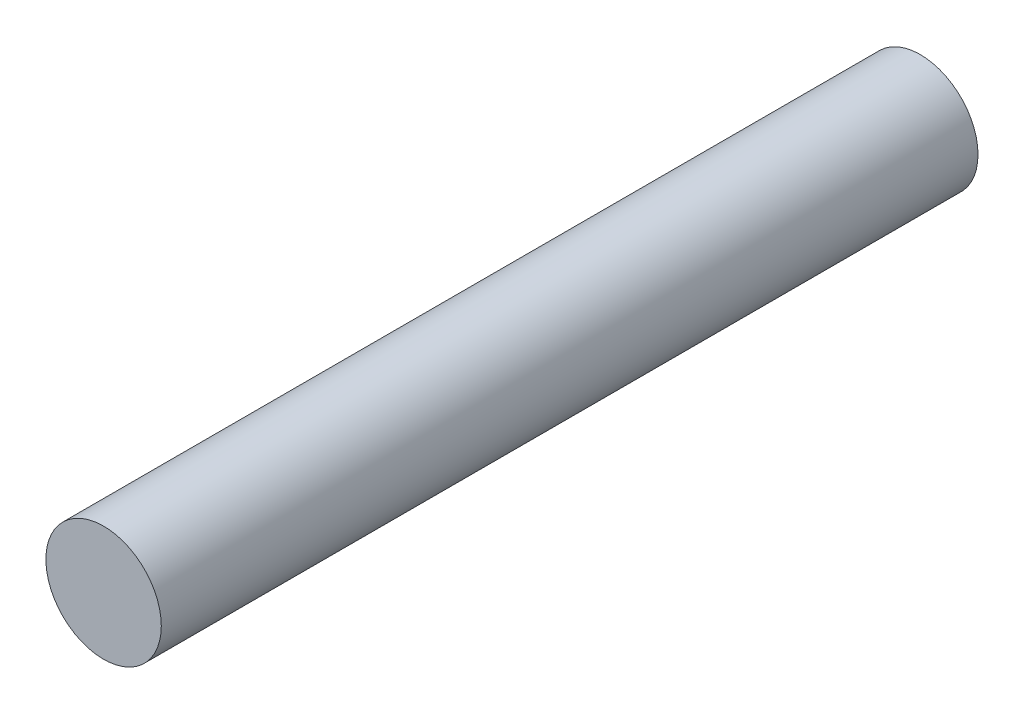
ISO-10303-21;
HEADER;
FILE_DESCRIPTION(('STEP AP214'),'2;1');
FILE_NAME('part.step','',(''),(''),'','','');
FILE_SCHEMA(('AUTOMOTIVE_DESIGN { 1 0 10303 214 1 1 1 1 }'));
ENDSEC;
DATA;
#1=APPLICATION_CONTEXT('core data for automotive mechanical design processes');
#2=APPLICATION_PROTOCOL_DEFINITION('international standard','automotive_design',2000,#1);
#3=PRODUCT_CONTEXT('',#1,'mechanical');
#4=PRODUCT('Part','Part','',(#3));
#5=PRODUCT_RELATED_PRODUCT_CATEGORY('part','',(#4));
#6=PRODUCT_DEFINITION_FORMATION('','',#4);
#7=PRODUCT_DEFINITION_CONTEXT('part definition',#1,'design');
#8=PRODUCT_DEFINITION('design','',#6,#7);
#9=PRODUCT_DEFINITION_SHAPE('','',#8);
#10=(LENGTH_UNIT() NAMED_UNIT(*) SI_UNIT(.MILLI.,.METRE.));
#11=(NAMED_UNIT(*) PLANE_ANGLE_UNIT() SI_UNIT($,.RADIAN.));
#12=(NAMED_UNIT(*) SI_UNIT($,.STERADIAN.) SOLID_ANGLE_UNIT());
#13=UNCERTAINTY_MEASURE_WITH_UNIT(LENGTH_MEASURE(1.E-05),#10,'distance_accuracy_value','');
#14=(GEOMETRIC_REPRESENTATION_CONTEXT(3) GLOBAL_UNCERTAINTY_ASSIGNED_CONTEXT((#13)) GLOBAL_UNIT_ASSIGNED_CONTEXT((#10,
#11,#12)) REPRESENTATION_CONTEXT('',''));
#15=CARTESIAN_POINT('',(0.,0.,0.));
#16=DIRECTION('',(0.,0.,1.));
#17=DIRECTION('',(1.,0.,0.));
#18=AXIS2_PLACEMENT_3D('',#15,#16,#17);
#19=CARTESIAN_POINT('',(0.,0.,-130.));
#20=DIRECTION('',(0.,0.,1.));
#21=DIRECTION('',(1.,0.,0.));
#22=AXIS2_PLACEMENT_3D('',#19,#20,#21);
#23=CYLINDRICAL_SURFACE('',#22,29.815);
#24=CARTESIAN_POINT('',(0.,0.,-130.));
#25=DIRECTION('',(0.,0.,1.));
#26=DIRECTION('',(1.,0.,0.));
#27=AXIS2_PLACEMENT_3D('',#24,#25,#26);
#28=CIRCLE('',#27,29.815);
#29=CARTESIAN_POINT('',(29.815,0.,-130.));
#30=VERTEX_POINT('',#29);
#31=EDGE_CURVE('E10',#30,#30,#28,.T.);
#32=ORIENTED_EDGE('',*,*,#31,.T.);
#33=EDGE_LOOP('',(#32));
#34=FACE_BOUND('',#33,.T.);
#35=CARTESIAN_POINT('',(0.,0.,292.));
#36=DIRECTION('',(0.,0.,1.));
#37=DIRECTION('',(1.,0.,0.));
#38=AXIS2_PLACEMENT_3D('',#35,#36,#37);
#39=CIRCLE('',#38,29.815);
#40=CARTESIAN_POINT('',(29.815,0.,292.));
#41=VERTEX_POINT('',#40);
#42=EDGE_CURVE('E48',#41,#41,#39,.T.);
#43=ORIENTED_EDGE('',*,*,#42,.F.);
#44=EDGE_LOOP('',(#43));
#45=FACE_BOUND('',#44,.T.);
#46=ADVANCED_FACE('F41',(#34,#45),#23,.T.);
#47=CARTESIAN_POINT('',(0.,0.,-130.));
#48=DIRECTION('',(0.,0.,1.));
#49=DIRECTION('',(1.,0.,0.));
#50=AXIS2_PLACEMENT_3D('',#47,#48,#49);
#51=PLANE('',#50);
#52=ORIENTED_EDGE('',*,*,#31,.F.);
#53=EDGE_LOOP('',(#52));
#54=FACE_BOUND('',#53,.T.);
#55=ADVANCED_FACE('F58',(#54),#51,.F.);
#56=CARTESIAN_POINT('',(0.,0.,292.));
#57=DIRECTION('',(0.,0.,1.));
#58=DIRECTION('',(1.,0.,0.));
#59=AXIS2_PLACEMENT_3D('',#56,#57,#58);
#60=PLANE('',#59);
#61=ORIENTED_EDGE('',*,*,#42,.T.);
#62=EDGE_LOOP('',(#61));
#63=FACE_BOUND('',#62,.T.);
#64=ADVANCED_FACE('F55',(#63),#60,.T.);
#65=CLOSED_SHELL('',(#46,#55,#64));
#66=MANIFOLD_SOLID_BREP('B2',#65);
#67=ADVANCED_BREP_SHAPE_REPRESENTATION('',(#18,#66),#14);
#68=SHAPE_DEFINITION_REPRESENTATION(#9,#67);
ENDSEC;
END-ISO-10303-21;
